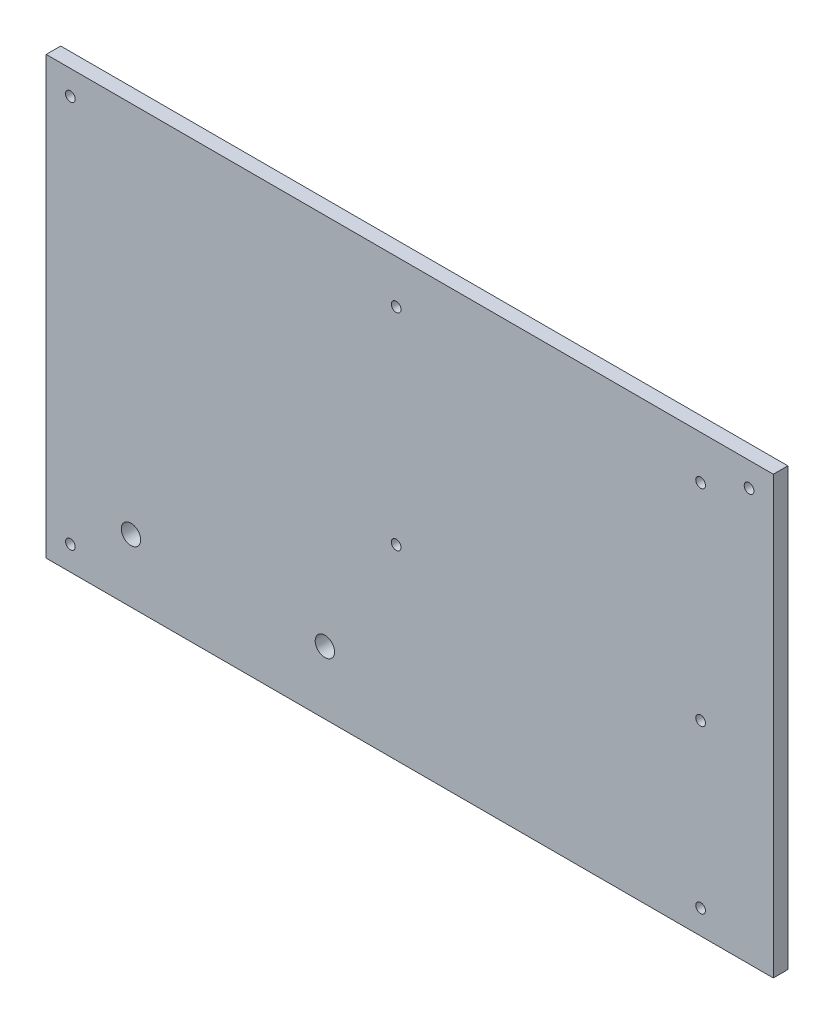
ISO-10303-21;
HEADER;
FILE_DESCRIPTION(('STEP AP214'),'2;1');
FILE_NAME('part.step','',(''),(''),'','','');
FILE_SCHEMA(('AUTOMOTIVE_DESIGN { 1 0 10303 214 1 1 1 1 }'));
ENDSEC;
DATA;
#1=APPLICATION_CONTEXT('core data for automotive mechanical design processes');
#2=APPLICATION_PROTOCOL_DEFINITION('international standard','automotive_design',2000,#1);
#3=PRODUCT_CONTEXT('',#1,'mechanical');
#4=PRODUCT('Part','Part','',(#3));
#5=PRODUCT_RELATED_PRODUCT_CATEGORY('part','',(#4));
#6=PRODUCT_DEFINITION_FORMATION('','',#4);
#7=PRODUCT_DEFINITION_CONTEXT('part definition',#1,'design');
#8=PRODUCT_DEFINITION('design','',#6,#7);
#9=PRODUCT_DEFINITION_SHAPE('','',#8);
#10=(LENGTH_UNIT() NAMED_UNIT(*) SI_UNIT(.MILLI.,.METRE.));
#11=(NAMED_UNIT(*) PLANE_ANGLE_UNIT() SI_UNIT($,.RADIAN.));
#12=(NAMED_UNIT(*) SI_UNIT($,.STERADIAN.) SOLID_ANGLE_UNIT());
#13=UNCERTAINTY_MEASURE_WITH_UNIT(LENGTH_MEASURE(1.E-05),#10,'distance_accuracy_value','');
#14=(GEOMETRIC_REPRESENTATION_CONTEXT(3) GLOBAL_UNCERTAINTY_ASSIGNED_CONTEXT((#13)) GLOBAL_UNIT_ASSIGNED_CONTEXT((#10,
#11,#12)) REPRESENTATION_CONTEXT('',''));
#15=CARTESIAN_POINT('',(0.,0.,0.));
#16=DIRECTION('',(0.,0.,1.));
#17=DIRECTION('',(1.,0.,0.));
#18=AXIS2_PLACEMENT_3D('',#15,#16,#17);
#19=CARTESIAN_POINT('',(150.,0.,6.));
#20=DIRECTION('',(1.,0.,0.));
#21=DIRECTION('',(0.,1.,0.));
#22=AXIS2_PLACEMENT_3D('',#19,#20,#21);
#23=PLANE('',#22);
#24=DIRECTION('',(0.,-1.,0.));
#25=VECTOR('',#24,1.);
#26=CARTESIAN_POINT('',(150.,0.,0.));
#27=LINE('',#26,#25);
#28=CARTESIAN_POINT('',(150.,89.9999999999999,0.));
#29=VERTEX_POINT('',#28);
#30=CARTESIAN_POINT('',(150.,-89.9999999999999,0.));
#31=VERTEX_POINT('',#30);
#32=EDGE_CURVE('E127',#29,#31,#27,.T.);
#33=ORIENTED_EDGE('',*,*,#32,.F.);
#34=DIRECTION('',(0.,0.,-1.));
#35=VECTOR('',#34,1.);
#36=CARTESIAN_POINT('',(150.,89.9999999999999,6.));
#37=LINE('',#36,#35);
#38=CARTESIAN_POINT('',(150.,89.9999999999999,6.));
#39=VERTEX_POINT('',#38);
#40=EDGE_CURVE('E11',#39,#29,#37,.T.);
#41=ORIENTED_EDGE('',*,*,#40,.F.);
#42=DIRECTION('',(0.,-1.,0.));
#43=VECTOR('',#42,1.);
#44=CARTESIAN_POINT('',(150.,0.,6.));
#45=LINE('',#44,#43);
#46=CARTESIAN_POINT('',(150.,-89.9999999999999,6.));
#47=VERTEX_POINT('',#46);
#48=EDGE_CURVE('E101',#39,#47,#45,.T.);
#49=ORIENTED_EDGE('',*,*,#48,.T.);
#50=DIRECTION('',(0.,0.,-1.));
#51=VECTOR('',#50,1.);
#52=CARTESIAN_POINT('',(150.,-89.9999999999999,6.));
#53=LINE('',#52,#51);
#54=EDGE_CURVE('E79',#47,#31,#53,.T.);
#55=ORIENTED_EDGE('',*,*,#54,.T.);
#56=EDGE_LOOP('',(#33,#41,#49,#55));
#57=FACE_BOUND('',#56,.T.);
#58=ADVANCED_FACE('F37',(#57),#23,.T.);
#59=CARTESIAN_POINT('',(0.,90.,6.));
#60=DIRECTION('',(0.,1.,0.));
#61=DIRECTION('',(-1.,0.,0.));
#62=AXIS2_PLACEMENT_3D('',#59,#60,#61);
#63=PLANE('',#62);
#64=DIRECTION('',(1.,0.,0.));
#65=VECTOR('',#64,1.);
#66=CARTESIAN_POINT('',(0.,90.,0.));
#67=LINE('',#66,#65);
#68=CARTESIAN_POINT('',(-150.,90.,0.));
#69=VERTEX_POINT('',#68);
#70=EDGE_CURVE('E91',#69,#29,#67,.T.);
#71=ORIENTED_EDGE('',*,*,#70,.F.);
#72=DIRECTION('',(0.,0.,-1.));
#73=VECTOR('',#72,1.);
#74=CARTESIAN_POINT('',(-150.,90.,6.));
#75=LINE('',#74,#73);
#76=CARTESIAN_POINT('',(-150.,90.,6.));
#77=VERTEX_POINT('',#76);
#78=EDGE_CURVE('E47',#77,#69,#75,.T.);
#79=ORIENTED_EDGE('',*,*,#78,.F.);
#80=DIRECTION('',(1.,0.,0.));
#81=VECTOR('',#80,1.);
#82=CARTESIAN_POINT('',(0.,90.,6.));
#83=LINE('',#82,#81);
#84=EDGE_CURVE('E89',#77,#39,#83,.T.);
#85=ORIENTED_EDGE('',*,*,#84,.T.);
#86=ORIENTED_EDGE('',*,*,#40,.T.);
#87=EDGE_LOOP('',(#71,#79,#85,#86));
#88=FACE_BOUND('',#87,.T.);
#89=ADVANCED_FACE('F87',(#88),#63,.T.);
#90=CARTESIAN_POINT('',(-150.,0.,6.));
#91=DIRECTION('',(1.,0.,0.));
#92=DIRECTION('',(0.,1.,0.));
#93=AXIS2_PLACEMENT_3D('',#90,#91,#92);
#94=PLANE('',#93);
#95=DIRECTION('',(0.,-1.,0.));
#96=VECTOR('',#95,1.);
#97=CARTESIAN_POINT('',(-150.,0.,0.));
#98=LINE('',#97,#96);
#99=CARTESIAN_POINT('',(-150.,-90.,0.));
#100=VERTEX_POINT('',#99);
#101=EDGE_CURVE('E130',#69,#100,#98,.T.);
#102=ORIENTED_EDGE('',*,*,#101,.T.);
#103=DIRECTION('',(0.,0.,-1.));
#104=VECTOR('',#103,1.);
#105=CARTESIAN_POINT('',(-150.,-90.,6.));
#106=LINE('',#105,#104);
#107=CARTESIAN_POINT('',(-150.,-90.,6.));
#108=VERTEX_POINT('',#107);
#109=EDGE_CURVE('E94',#108,#100,#106,.T.);
#110=ORIENTED_EDGE('',*,*,#109,.F.);
#111=DIRECTION('',(0.,-1.,0.));
#112=VECTOR('',#111,1.);
#113=CARTESIAN_POINT('',(-150.,0.,6.));
#114=LINE('',#113,#112);
#115=EDGE_CURVE('E97',#77,#108,#114,.T.);
#116=ORIENTED_EDGE('',*,*,#115,.F.);
#117=ORIENTED_EDGE('',*,*,#78,.T.);
#118=EDGE_LOOP('',(#102,#110,#116,#117));
#119=FACE_BOUND('',#118,.T.);
#120=ADVANCED_FACE('F98',(#119),#94,.F.);
#121=CARTESIAN_POINT('',(120.,-80.,6.));
#122=DIRECTION('',(0.,0.,-1.));
#123=DIRECTION('',(-1.,0.,0.));
#124=AXIS2_PLACEMENT_3D('',#121,#122,#123);
#125=CYLINDRICAL_SURFACE('',#124,2.);
#126=CARTESIAN_POINT('',(120.,-80.,6.));
#127=DIRECTION('',(0.,0.,1.));
#128=DIRECTION('',(1.,0.,0.));
#129=AXIS2_PLACEMENT_3D('',#126,#127,#128);
#130=CIRCLE('',#129,2.);
#131=CARTESIAN_POINT('',(122.,-80.,6.));
#132=VERTEX_POINT('',#131);
#133=EDGE_CURVE('E103',#132,#132,#130,.T.);
#134=ORIENTED_EDGE('',*,*,#133,.T.);
#135=EDGE_LOOP('',(#134));
#136=FACE_BOUND('',#135,.T.);
#137=CARTESIAN_POINT('',(120.,-80.,0.));
#138=DIRECTION('',(0.,0.,1.));
#139=DIRECTION('',(1.,0.,0.));
#140=AXIS2_PLACEMENT_3D('',#137,#138,#139);
#141=CIRCLE('',#140,2.);
#142=CARTESIAN_POINT('',(122.,-80.,0.));
#143=VERTEX_POINT('',#142);
#144=EDGE_CURVE('E124',#143,#143,#141,.T.);
#145=ORIENTED_EDGE('',*,*,#144,.F.);
#146=EDGE_LOOP('',(#145));
#147=FACE_BOUND('',#146,.T.);
#148=ADVANCED_FACE('F173',(#136,#147),#125,.F.);
#149=CARTESIAN_POINT('',(140.,80.,6.));
#150=DIRECTION('',(0.,0.,-1.));
#151=DIRECTION('',(-1.,0.,0.));
#152=AXIS2_PLACEMENT_3D('',#149,#150,#151);
#153=CYLINDRICAL_SURFACE('',#152,2.);
#154=CARTESIAN_POINT('',(140.,80.,6.));
#155=DIRECTION('',(0.,0.,1.));
#156=DIRECTION('',(1.,0.,0.));
#157=AXIS2_PLACEMENT_3D('',#154,#155,#156);
#158=CIRCLE('',#157,2.);
#159=CARTESIAN_POINT('',(142.,80.,6.));
#160=VERTEX_POINT('',#159);
#161=EDGE_CURVE('E168',#160,#160,#158,.T.);
#162=ORIENTED_EDGE('',*,*,#161,.T.);
#163=EDGE_LOOP('',(#162));
#164=FACE_BOUND('',#163,.T.);
#165=CARTESIAN_POINT('',(140.,80.,0.));
#166=DIRECTION('',(0.,0.,1.));
#167=DIRECTION('',(1.,0.,0.));
#168=AXIS2_PLACEMENT_3D('',#165,#166,#167);
#169=CIRCLE('',#168,2.);
#170=CARTESIAN_POINT('',(142.,80.,0.));
#171=VERTEX_POINT('',#170);
#172=EDGE_CURVE('E121',#171,#171,#169,.T.);
#173=ORIENTED_EDGE('',*,*,#172,.F.);
#174=EDGE_LOOP('',(#173));
#175=FACE_BOUND('',#174,.T.);
#176=ADVANCED_FACE('F202',(#164,#175),#153,.F.);
#177=CARTESIAN_POINT('',(-140.,79.9999999999999,6.));
#178=DIRECTION('',(0.,0.,-1.));
#179=DIRECTION('',(-1.,0.,0.));
#180=AXIS2_PLACEMENT_3D('',#177,#178,#179);
#181=CYLINDRICAL_SURFACE('',#180,2.);
#182=CARTESIAN_POINT('',(-140.,79.9999999999999,6.));
#183=DIRECTION('',(0.,0.,1.));
#184=DIRECTION('',(1.,0.,0.));
#185=AXIS2_PLACEMENT_3D('',#182,#183,#184);
#186=CIRCLE('',#185,2.);
#187=CARTESIAN_POINT('',(-138.,79.9999999999999,6.));
#188=VERTEX_POINT('',#187);
#189=EDGE_CURVE('E165',#188,#188,#186,.T.);
#190=ORIENTED_EDGE('',*,*,#189,.T.);
#191=EDGE_LOOP('',(#190));
#192=FACE_BOUND('',#191,.T.);
#193=CARTESIAN_POINT('',(-140.,79.9999999999999,0.));
#194=DIRECTION('',(0.,0.,1.));
#195=DIRECTION('',(1.,0.,0.));
#196=AXIS2_PLACEMENT_3D('',#193,#194,#195);
#197=CIRCLE('',#196,2.);
#198=CARTESIAN_POINT('',(-138.,79.9999999999999,0.));
#199=VERTEX_POINT('',#198);
#200=EDGE_CURVE('E118',#199,#199,#197,.T.);
#201=ORIENTED_EDGE('',*,*,#200,.F.);
#202=EDGE_LOOP('',(#201));
#203=FACE_BOUND('',#202,.T.);
#204=ADVANCED_FACE('F205',(#192,#203),#181,.F.);
#205=CARTESIAN_POINT('',(-140.,-80.,6.));
#206=DIRECTION('',(0.,0.,-1.));
#207=DIRECTION('',(-1.,0.,0.));
#208=AXIS2_PLACEMENT_3D('',#205,#206,#207);
#209=CYLINDRICAL_SURFACE('',#208,2.);
#210=CARTESIAN_POINT('',(-140.,-80.,6.));
#211=DIRECTION('',(0.,0.,1.));
#212=DIRECTION('',(1.,0.,0.));
#213=AXIS2_PLACEMENT_3D('',#210,#211,#212);
#214=CIRCLE('',#213,2.);
#215=CARTESIAN_POINT('',(-138.,-80.,6.));
#216=VERTEX_POINT('',#215);
#217=EDGE_CURVE('E162',#216,#216,#214,.T.);
#218=ORIENTED_EDGE('',*,*,#217,.T.);
#219=EDGE_LOOP('',(#218));
#220=FACE_BOUND('',#219,.T.);
#221=CARTESIAN_POINT('',(-140.,-80.,0.));
#222=DIRECTION('',(0.,0.,1.));
#223=DIRECTION('',(1.,0.,0.));
#224=AXIS2_PLACEMENT_3D('',#221,#222,#223);
#225=CIRCLE('',#224,2.);
#226=CARTESIAN_POINT('',(-138.,-80.,0.));
#227=VERTEX_POINT('',#226);
#228=EDGE_CURVE('E115',#227,#227,#225,.T.);
#229=ORIENTED_EDGE('',*,*,#228,.F.);
#230=EDGE_LOOP('',(#229));
#231=FACE_BOUND('',#230,.T.);
#232=ADVANCED_FACE('F209',(#220,#231),#209,.F.);
#233=CARTESIAN_POINT('',(-115.,-64.,6.));
#234=DIRECTION('',(0.,0.,-1.));
#235=DIRECTION('',(-1.,0.,0.));
#236=AXIS2_PLACEMENT_3D('',#233,#234,#235);
#237=CYLINDRICAL_SURFACE('',#236,4.00000000000001);
#238=CARTESIAN_POINT('',(-115.,-64.,6.));
#239=DIRECTION('',(0.,0.,1.));
#240=DIRECTION('',(1.,0.,0.));
#241=AXIS2_PLACEMENT_3D('',#238,#239,#240);
#242=CIRCLE('',#241,4.00000000000001);
#243=CARTESIAN_POINT('',(-111.,-64.,6.));
#244=VERTEX_POINT('',#243);
#245=EDGE_CURVE('E159',#244,#244,#242,.T.);
#246=ORIENTED_EDGE('',*,*,#245,.T.);
#247=EDGE_LOOP('',(#246));
#248=FACE_BOUND('',#247,.T.);
#249=CARTESIAN_POINT('',(-115.,-64.,0.));
#250=DIRECTION('',(0.,0.,1.));
#251=DIRECTION('',(1.,0.,0.));
#252=AXIS2_PLACEMENT_3D('',#249,#250,#251);
#253=CIRCLE('',#252,4.00000000000001);
#254=CARTESIAN_POINT('',(-111.,-64.,0.));
#255=VERTEX_POINT('',#254);
#256=EDGE_CURVE('E111',#255,#255,#253,.T.);
#257=ORIENTED_EDGE('',*,*,#256,.F.);
#258=EDGE_LOOP('',(#257));
#259=FACE_BOUND('',#258,.T.);
#260=ADVANCED_FACE('F212',(#248,#259),#237,.F.);
#261=CARTESIAN_POINT('',(-34.9999999999999,-64.,6.));
#262=DIRECTION('',(0.,0.,-1.));
#263=DIRECTION('',(-1.,0.,0.));
#264=AXIS2_PLACEMENT_3D('',#261,#262,#263);
#265=CYLINDRICAL_SURFACE('',#264,4.);
#266=CARTESIAN_POINT('',(-34.9999999999999,-64.,6.));
#267=DIRECTION('',(0.,0.,1.));
#268=DIRECTION('',(1.,0.,0.));
#269=AXIS2_PLACEMENT_3D('',#266,#267,#268);
#270=CIRCLE('',#269,4.);
#271=CARTESIAN_POINT('',(-30.9999999999999,-64.,6.));
#272=VERTEX_POINT('',#271);
#273=EDGE_CURVE('E133',#272,#272,#270,.T.);
#274=ORIENTED_EDGE('',*,*,#273,.T.);
#275=EDGE_LOOP('',(#274));
#276=FACE_BOUND('',#275,.T.);
#277=CARTESIAN_POINT('',(-34.9999999999999,-64.,0.));
#278=DIRECTION('',(0.,0.,1.));
#279=DIRECTION('',(1.,0.,0.));
#280=AXIS2_PLACEMENT_3D('',#277,#278,#279);
#281=CIRCLE('',#280,4.);
#282=CARTESIAN_POINT('',(-30.9999999999999,-64.,0.));
#283=VERTEX_POINT('',#282);
#284=EDGE_CURVE('E108',#283,#283,#281,.T.);
#285=ORIENTED_EDGE('',*,*,#284,.F.);
#286=EDGE_LOOP('',(#285));
#287=FACE_BOUND('',#286,.T.);
#288=ADVANCED_FACE('F39',(#276,#287),#265,.F.);
#289=CARTESIAN_POINT('',(0.,-90.,6.));
#290=DIRECTION('',(0.,1.,0.));
#291=DIRECTION('',(-1.,0.,0.));
#292=AXIS2_PLACEMENT_3D('',#289,#290,#291);
#293=PLANE('',#292);
#294=DIRECTION('',(1.,0.,0.));
#295=VECTOR('',#294,1.);
#296=CARTESIAN_POINT('',(0.,-90.,0.));
#297=LINE('',#296,#295);
#298=EDGE_CURVE('E72',#100,#31,#297,.T.);
#299=ORIENTED_EDGE('',*,*,#298,.T.);
#300=ORIENTED_EDGE('',*,*,#54,.F.);
#301=DIRECTION('',(1.,0.,0.));
#302=VECTOR('',#301,1.);
#303=CARTESIAN_POINT('',(0.,-90.,6.));
#304=LINE('',#303,#302);
#305=EDGE_CURVE('E56',#108,#47,#304,.T.);
#306=ORIENTED_EDGE('',*,*,#305,.F.);
#307=ORIENTED_EDGE('',*,*,#109,.T.);
#308=EDGE_LOOP('',(#299,#300,#306,#307));
#309=FACE_BOUND('',#308,.T.);
#310=ADVANCED_FACE('F178',(#309),#293,.F.);
#311=CARTESIAN_POINT('',(0.,0.,6.));
#312=DIRECTION('',(0.,0.,1.));
#313=DIRECTION('',(1.,0.,0.));
#314=AXIS2_PLACEMENT_3D('',#311,#312,#313);
#315=PLANE('',#314);
#316=CARTESIAN_POINT('',(-5.59999999999997,72.,6.));
#317=DIRECTION('',(0.,0.,1.));
#318=DIRECTION('',(1.,0.,0.));
#319=AXIS2_PLACEMENT_3D('',#316,#317,#318);
#320=CIRCLE('',#319,2.);
#321=CARTESIAN_POINT('',(-3.59999999999996,72.,6.));
#322=VERTEX_POINT('',#321);
#323=EDGE_CURVE('E142',#322,#322,#320,.T.);
#324=ORIENTED_EDGE('',*,*,#323,.F.);
#325=EDGE_LOOP('',(#324));
#326=FACE_BOUND('',#325,.T.);
#327=CARTESIAN_POINT('',(-5.59999999999997,-13.0000000000001,6.));
#328=DIRECTION('',(0.,0.,1.));
#329=DIRECTION('',(1.,0.,0.));
#330=AXIS2_PLACEMENT_3D('',#327,#328,#329);
#331=CIRCLE('',#330,2.);
#332=CARTESIAN_POINT('',(-3.59999999999996,-13.0000000000001,6.));
#333=VERTEX_POINT('',#332);
#334=EDGE_CURVE('E308',#333,#333,#331,.T.);
#335=ORIENTED_EDGE('',*,*,#334,.F.);
#336=EDGE_LOOP('',(#335));
#337=FACE_BOUND('',#336,.T.);
#338=CARTESIAN_POINT('',(120.,-13.0000000000001,6.));
#339=DIRECTION('',(0.,0.,1.));
#340=DIRECTION('',(1.,0.,0.));
#341=AXIS2_PLACEMENT_3D('',#338,#339,#340);
#342=CIRCLE('',#341,2.);
#343=CARTESIAN_POINT('',(122.,-13.0000000000001,6.));
#344=VERTEX_POINT('',#343);
#345=EDGE_CURVE('E155',#344,#344,#342,.T.);
#346=ORIENTED_EDGE('',*,*,#345,.F.);
#347=EDGE_LOOP('',(#346));
#348=FACE_BOUND('',#347,.T.);
#349=CARTESIAN_POINT('',(120.,72.,6.));
#350=DIRECTION('',(0.,0.,1.));
#351=DIRECTION('',(1.,0.,0.));
#352=AXIS2_PLACEMENT_3D('',#349,#350,#351);
#353=CIRCLE('',#352,2.);
#354=CARTESIAN_POINT('',(122.,72.,6.));
#355=VERTEX_POINT('',#354);
#356=EDGE_CURVE('E138',#355,#355,#353,.T.);
#357=ORIENTED_EDGE('',*,*,#356,.F.);
#358=EDGE_LOOP('',(#357));
#359=FACE_BOUND('',#358,.T.);
#360=ORIENTED_EDGE('',*,*,#273,.F.);
#361=EDGE_LOOP('',(#360));
#362=FACE_BOUND('',#361,.T.);
#363=ORIENTED_EDGE('',*,*,#245,.F.);
#364=EDGE_LOOP('',(#363));
#365=FACE_BOUND('',#364,.T.);
#366=ORIENTED_EDGE('',*,*,#217,.F.);
#367=EDGE_LOOP('',(#366));
#368=FACE_BOUND('',#367,.T.);
#369=ORIENTED_EDGE('',*,*,#189,.F.);
#370=EDGE_LOOP('',(#369));
#371=FACE_BOUND('',#370,.T.);
#372=ORIENTED_EDGE('',*,*,#161,.F.);
#373=EDGE_LOOP('',(#372));
#374=FACE_BOUND('',#373,.T.);
#375=ORIENTED_EDGE('',*,*,#133,.F.);
#376=EDGE_LOOP('',(#375));
#377=FACE_BOUND('',#376,.T.);
#378=ORIENTED_EDGE('',*,*,#48,.F.);
#379=ORIENTED_EDGE('',*,*,#84,.F.);
#380=ORIENTED_EDGE('',*,*,#115,.T.);
#381=ORIENTED_EDGE('',*,*,#305,.T.);
#382=EDGE_LOOP('',(#378,#379,#380,#381));
#383=FACE_BOUND('',#382,.T.);
#384=ADVANCED_FACE('F100',(#326,#337,#348,#359,#362,#365,#368,#371,#374,#377,#383),#315,.T.);
#385=CARTESIAN_POINT('',(0.,0.,0.));
#386=DIRECTION('',(0.,0.,1.));
#387=DIRECTION('',(1.,0.,0.));
#388=AXIS2_PLACEMENT_3D('',#385,#386,#387);
#389=PLANE('',#388);
#390=CARTESIAN_POINT('',(-5.59999999999997,72.,0.));
#391=DIRECTION('',(0.,0.,1.));
#392=DIRECTION('',(1.,0.,0.));
#393=AXIS2_PLACEMENT_3D('',#390,#391,#392);
#394=CIRCLE('',#393,2.);
#395=CARTESIAN_POINT('',(-3.59999999999996,72.,0.));
#396=VERTEX_POINT('',#395);
#397=EDGE_CURVE('E41',#396,#396,#394,.T.);
#398=ORIENTED_EDGE('',*,*,#397,.T.);
#399=EDGE_LOOP('',(#398));
#400=FACE_BOUND('',#399,.T.);
#401=CARTESIAN_POINT('',(-5.59999999999997,-13.0000000000001,0.));
#402=DIRECTION('',(0.,0.,1.));
#403=DIRECTION('',(1.,0.,0.));
#404=AXIS2_PLACEMENT_3D('',#401,#402,#403);
#405=CIRCLE('',#404,2.);
#406=CARTESIAN_POINT('',(-3.59999999999996,-13.0000000000001,0.));
#407=VERTEX_POINT('',#406);
#408=EDGE_CURVE('E141',#407,#407,#405,.T.);
#409=ORIENTED_EDGE('',*,*,#408,.T.);
#410=EDGE_LOOP('',(#409));
#411=FACE_BOUND('',#410,.T.);
#412=CARTESIAN_POINT('',(120.,-13.0000000000001,0.));
#413=DIRECTION('',(0.,0.,1.));
#414=DIRECTION('',(1.,0.,0.));
#415=AXIS2_PLACEMENT_3D('',#412,#413,#414);
#416=CIRCLE('',#415,2.);
#417=CARTESIAN_POINT('',(122.,-13.0000000000001,0.));
#418=VERTEX_POINT('',#417);
#419=EDGE_CURVE('E139',#418,#418,#416,.T.);
#420=ORIENTED_EDGE('',*,*,#419,.T.);
#421=EDGE_LOOP('',(#420));
#422=FACE_BOUND('',#421,.T.);
#423=CARTESIAN_POINT('',(120.,72.,0.));
#424=DIRECTION('',(0.,0.,1.));
#425=DIRECTION('',(1.,0.,0.));
#426=AXIS2_PLACEMENT_3D('',#423,#424,#425);
#427=CIRCLE('',#426,2.);
#428=CARTESIAN_POINT('',(122.,72.,0.));
#429=VERTEX_POINT('',#428);
#430=EDGE_CURVE('E112',#429,#429,#427,.T.);
#431=ORIENTED_EDGE('',*,*,#430,.T.);
#432=EDGE_LOOP('',(#431));
#433=FACE_BOUND('',#432,.T.);
#434=ORIENTED_EDGE('',*,*,#284,.T.);
#435=EDGE_LOOP('',(#434));
#436=FACE_BOUND('',#435,.T.);
#437=ORIENTED_EDGE('',*,*,#256,.T.);
#438=EDGE_LOOP('',(#437));
#439=FACE_BOUND('',#438,.T.);
#440=ORIENTED_EDGE('',*,*,#228,.T.);
#441=EDGE_LOOP('',(#440));
#442=FACE_BOUND('',#441,.T.);
#443=ORIENTED_EDGE('',*,*,#200,.T.);
#444=EDGE_LOOP('',(#443));
#445=FACE_BOUND('',#444,.T.);
#446=ORIENTED_EDGE('',*,*,#172,.T.);
#447=EDGE_LOOP('',(#446));
#448=FACE_BOUND('',#447,.T.);
#449=ORIENTED_EDGE('',*,*,#144,.T.);
#450=EDGE_LOOP('',(#449));
#451=FACE_BOUND('',#450,.T.);
#452=ORIENTED_EDGE('',*,*,#32,.T.);
#453=ORIENTED_EDGE('',*,*,#298,.F.);
#454=ORIENTED_EDGE('',*,*,#101,.F.);
#455=ORIENTED_EDGE('',*,*,#70,.T.);
#456=EDGE_LOOP('',(#452,#453,#454,#455));
#457=FACE_BOUND('',#456,.T.);
#458=ADVANCED_FACE('F177',(#400,#411,#422,#433,#436,#439,#442,#445,#448,#451,#457),#389,.F.);
#459=CARTESIAN_POINT('',(120.,72.,-4.));
#460=DIRECTION('',(0.,0.,1.));
#461=DIRECTION('',(1.,0.,0.));
#462=AXIS2_PLACEMENT_3D('',#459,#460,#461);
#463=CYLINDRICAL_SURFACE('',#462,2.);
#464=ORIENTED_EDGE('',*,*,#356,.T.);
#465=EDGE_LOOP('',(#464));
#466=FACE_BOUND('',#465,.T.);
#467=ORIENTED_EDGE('',*,*,#430,.F.);
#468=EDGE_LOOP('',(#467));
#469=FACE_BOUND('',#468,.T.);
#470=ADVANCED_FACE('F185',(#466,#469),#463,.F.);
#471=CARTESIAN_POINT('',(120.,-13.0000000000001,-4.));
#472=DIRECTION('',(0.,0.,1.));
#473=DIRECTION('',(1.,0.,0.));
#474=AXIS2_PLACEMENT_3D('',#471,#472,#473);
#475=CYLINDRICAL_SURFACE('',#474,2.);
#476=ORIENTED_EDGE('',*,*,#345,.T.);
#477=EDGE_LOOP('',(#476));
#478=FACE_BOUND('',#477,.T.);
#479=ORIENTED_EDGE('',*,*,#419,.F.);
#480=EDGE_LOOP('',(#479));
#481=FACE_BOUND('',#480,.T.);
#482=ADVANCED_FACE('F274',(#478,#481),#475,.F.);
#483=CARTESIAN_POINT('',(-5.59999999999997,-13.0000000000001,-4.));
#484=DIRECTION('',(0.,0.,1.));
#485=DIRECTION('',(1.,0.,0.));
#486=AXIS2_PLACEMENT_3D('',#483,#484,#485);
#487=CYLINDRICAL_SURFACE('',#486,2.);
#488=ORIENTED_EDGE('',*,*,#334,.T.);
#489=EDGE_LOOP('',(#488));
#490=FACE_BOUND('',#489,.T.);
#491=ORIENTED_EDGE('',*,*,#408,.F.);
#492=EDGE_LOOP('',(#491));
#493=FACE_BOUND('',#492,.T.);
#494=ADVANCED_FACE('F282',(#490,#493),#487,.F.);
#495=CARTESIAN_POINT('',(-5.59999999999997,72.,-4.));
#496=DIRECTION('',(0.,0.,1.));
#497=DIRECTION('',(1.,0.,0.));
#498=AXIS2_PLACEMENT_3D('',#495,#496,#497);
#499=CYLINDRICAL_SURFACE('',#498,2.);
#500=ORIENTED_EDGE('',*,*,#323,.T.);
#501=EDGE_LOOP('',(#500));
#502=FACE_BOUND('',#501,.T.);
#503=ORIENTED_EDGE('',*,*,#397,.F.);
#504=EDGE_LOOP('',(#503));
#505=FACE_BOUND('',#504,.T.);
#506=ADVANCED_FACE('F292',(#502,#505),#499,.F.);
#507=CLOSED_SHELL('',(#58,#89,#120,#148,#176,#204,#232,#260,#288,#310,#384,#458,#470,#482,#494,#506));
#508=MANIFOLD_SOLID_BREP('B2',#507);
#509=ADVANCED_BREP_SHAPE_REPRESENTATION('',(#18,#508),#14);
#510=SHAPE_DEFINITION_REPRESENTATION(#9,#509);
ENDSEC;
END-ISO-10303-21;
